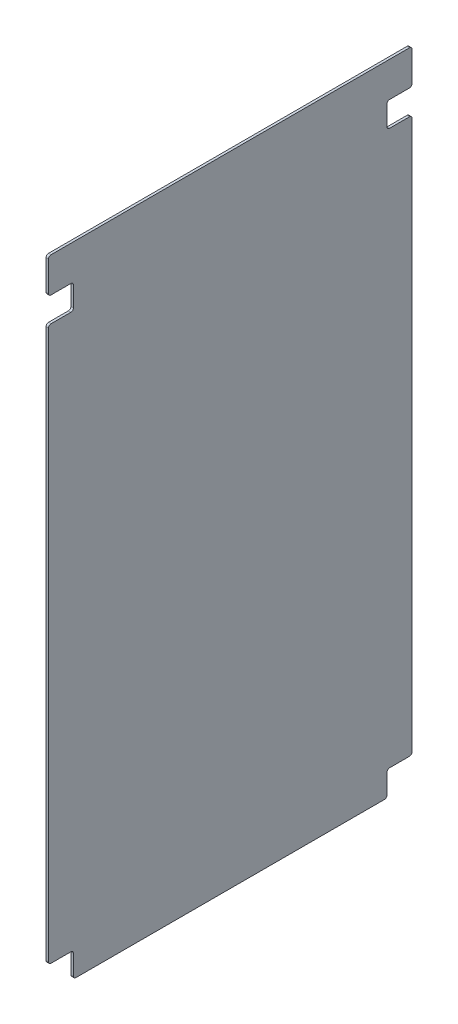
ISO-10303-21;
HEADER;
FILE_DESCRIPTION(('STEP AP214'),'2;1');
FILE_NAME('part.step','',(''),(''),'','','');
FILE_SCHEMA(('AUTOMOTIVE_DESIGN { 1 0 10303 214 1 1 1 1 }'));
ENDSEC;
DATA;
#1=APPLICATION_CONTEXT('core data for automotive mechanical design processes');
#2=APPLICATION_PROTOCOL_DEFINITION('international standard','automotive_design',2000,#1);
#3=PRODUCT_CONTEXT('',#1,'mechanical');
#4=PRODUCT('Part','Part','',(#3));
#5=PRODUCT_RELATED_PRODUCT_CATEGORY('part','',(#4));
#6=PRODUCT_DEFINITION_FORMATION('','',#4);
#7=PRODUCT_DEFINITION_CONTEXT('part definition',#1,'design');
#8=PRODUCT_DEFINITION('design','',#6,#7);
#9=PRODUCT_DEFINITION_SHAPE('','',#8);
#10=(LENGTH_UNIT() NAMED_UNIT(*) SI_UNIT(.MILLI.,.METRE.));
#11=(NAMED_UNIT(*) PLANE_ANGLE_UNIT() SI_UNIT($,.RADIAN.));
#12=(NAMED_UNIT(*) SI_UNIT($,.STERADIAN.) SOLID_ANGLE_UNIT());
#13=UNCERTAINTY_MEASURE_WITH_UNIT(LENGTH_MEASURE(1.E-05),#10,'distance_accuracy_value','');
#14=(GEOMETRIC_REPRESENTATION_CONTEXT(3) GLOBAL_UNCERTAINTY_ASSIGNED_CONTEXT((#13)) GLOBAL_UNIT_ASSIGNED_CONTEXT((#10,
#11,#12)) REPRESENTATION_CONTEXT('',''));
#15=CARTESIAN_POINT('',(0.,0.,0.));
#16=DIRECTION('',(0.,0.,1.));
#17=DIRECTION('',(1.,0.,0.));
#18=AXIS2_PLACEMENT_3D('',#15,#16,#17);
#19=CARTESIAN_POINT('',(3.175,0.,-463.55));
#20=DIRECTION('',(0.,0.,1.));
#21=DIRECTION('',(1.,0.,0.));
#22=AXIS2_PLACEMENT_3D('',#19,#20,#21);
#23=PLANE('',#22);
#24=DIRECTION('',(0.,1.,0.));
#25=VECTOR('',#24,1.);
#26=CARTESIAN_POINT('',(3.175,0.,-463.55));
#27=LINE('',#26,#25);
#28=CARTESIAN_POINT('',(3.175,773.1125,-463.55));
#29=VERTEX_POINT('',#28);
#30=CARTESIAN_POINT('',(3.175,811.2125,-463.55));
#31=VERTEX_POINT('',#30);
#32=EDGE_CURVE('E477',#29,#31,#27,.T.);
#33=ORIENTED_EDGE('',*,*,#32,.F.);
#34=DIRECTION('',(1.,0.,0.));
#35=VECTOR('',#34,1.);
#36=CARTESIAN_POINT('',(3.175,773.1125,-463.55));
#37=LINE('',#36,#35);
#38=CARTESIAN_POINT('',(0.,773.1125,-463.55));
#39=VERTEX_POINT('',#38);
#40=EDGE_CURVE('E250',#29,#39,#37,.F.);
#41=ORIENTED_EDGE('',*,*,#40,.T.);
#42=DIRECTION('',(0.,1.,0.));
#43=VECTOR('',#42,1.);
#44=CARTESIAN_POINT('',(0.,0.,-463.55));
#45=LINE('',#44,#43);
#46=CARTESIAN_POINT('',(0.,811.2125,-463.55));
#47=VERTEX_POINT('',#46);
#48=EDGE_CURVE('E243',#39,#47,#45,.T.);
#49=ORIENTED_EDGE('',*,*,#48,.T.);
#50=DIRECTION('',(-1.,0.,0.));
#51=VECTOR('',#50,1.);
#52=CARTESIAN_POINT('',(3.175,811.2125,-463.55));
#53=LINE('',#52,#51);
#54=EDGE_CURVE('E247',#47,#31,#53,.F.);
#55=ORIENTED_EDGE('',*,*,#54,.T.);
#56=EDGE_LOOP('',(#33,#41,#49,#55));
#57=FACE_BOUND('',#56,.T.);
#58=ADVANCED_FACE('F32',(#57),#23,.F.);
#59=CARTESIAN_POINT('',(3.175,0.,0.));
#60=DIRECTION('',(0.,0.,-1.));
#61=DIRECTION('',(-1.,0.,0.));
#62=AXIS2_PLACEMENT_3D('',#59,#60,#61);
#63=PLANE('',#62);
#64=DIRECTION('',(0.,-1.,0.));
#65=VECTOR('',#64,1.);
#66=CARTESIAN_POINT('',(0.,0.,0.));
#67=LINE('',#66,#65);
#68=CARTESIAN_POINT('',(0.,811.2125,0.));
#69=VERTEX_POINT('',#68);
#70=CARTESIAN_POINT('',(0.,773.1125,0.));
#71=VERTEX_POINT('',#70);
#72=EDGE_CURVE('E479',#69,#71,#67,.T.);
#73=ORIENTED_EDGE('',*,*,#72,.T.);
#74=DIRECTION('',(1.,0.,0.));
#75=VECTOR('',#74,1.);
#76=CARTESIAN_POINT('',(3.175,773.1125,0.));
#77=LINE('',#76,#75);
#78=CARTESIAN_POINT('',(3.175,773.1125,0.));
#79=VERTEX_POINT('',#78);
#80=EDGE_CURVE('E311',#71,#79,#77,.T.);
#81=ORIENTED_EDGE('',*,*,#80,.T.);
#82=DIRECTION('',(0.,-1.,0.));
#83=VECTOR('',#82,1.);
#84=CARTESIAN_POINT('',(3.175,0.,0.));
#85=LINE('',#84,#83);
#86=CARTESIAN_POINT('',(3.175,811.2125,0.));
#87=VERTEX_POINT('',#86);
#88=EDGE_CURVE('E470',#87,#79,#85,.T.);
#89=ORIENTED_EDGE('',*,*,#88,.F.);
#90=DIRECTION('',(-1.,0.,0.));
#91=VECTOR('',#90,1.);
#92=CARTESIAN_POINT('',(3.175,811.2125,0.));
#93=LINE('',#92,#91);
#94=EDGE_CURVE('E279',#87,#69,#93,.T.);
#95=ORIENTED_EDGE('',*,*,#94,.T.);
#96=EDGE_LOOP('',(#73,#81,#89,#95));
#97=FACE_BOUND('',#96,.T.);
#98=ADVANCED_FACE('F525',(#97),#63,.F.);
#99=CARTESIAN_POINT('',(0.,735.0125,0.));
#100=VERTEX_POINT('',#99);
#101=CARTESIAN_POINT('',(0.,34.925,0.));
#102=VERTEX_POINT('',#101);
#103=EDGE_CURVE('E469',#100,#102,#67,.T.);
#104=ORIENTED_EDGE('',*,*,#103,.T.);
#105=DIRECTION('',(1.,0.,0.));
#106=VECTOR('',#105,1.);
#107=CARTESIAN_POINT('',(3.175,34.925,0.));
#108=LINE('',#107,#106);
#109=CARTESIAN_POINT('',(3.175,34.925,0.));
#110=VERTEX_POINT('',#109);
#111=EDGE_CURVE('E390',#102,#110,#108,.T.);
#112=ORIENTED_EDGE('',*,*,#111,.T.);
#113=CARTESIAN_POINT('',(3.175,735.0125,0.));
#114=VERTEX_POINT('',#113);
#115=EDGE_CURVE('E474',#114,#110,#85,.T.);
#116=ORIENTED_EDGE('',*,*,#115,.F.);
#117=DIRECTION('',(1.,0.,0.));
#118=VECTOR('',#117,1.);
#119=CARTESIAN_POINT('',(3.175,735.0125,0.));
#120=LINE('',#119,#118);
#121=EDGE_CURVE('E300',#114,#100,#120,.F.);
#122=ORIENTED_EDGE('',*,*,#121,.T.);
#123=EDGE_LOOP('',(#104,#112,#116,#122));
#124=FACE_BOUND('',#123,.T.);
#125=ADVANCED_FACE('F491',(#124),#63,.F.);
#126=CARTESIAN_POINT('',(3.175,0.,0.));
#127=DIRECTION('',(0.,1.,0.));
#128=DIRECTION('',(0.,0.,1.));
#129=AXIS2_PLACEMENT_3D('',#126,#127,#128);
#130=PLANE('',#129);
#131=DIRECTION('',(0.,0.,-1.));
#132=VECTOR('',#131,1.);
#133=CARTESIAN_POINT('',(0.,0.,0.));
#134=LINE('',#133,#132);
#135=CARTESIAN_POINT('',(0.,0.,-34.925));
#136=VERTEX_POINT('',#135);
#137=CARTESIAN_POINT('',(0.,0.,-428.625));
#138=VERTEX_POINT('',#137);
#139=EDGE_CURVE('E253',#136,#138,#134,.T.);
#140=ORIENTED_EDGE('',*,*,#139,.T.);
#141=DIRECTION('',(1.,0.,0.));
#142=VECTOR('',#141,1.);
#143=CARTESIAN_POINT('',(3.175,0.,-428.625));
#144=LINE('',#143,#142);
#145=CARTESIAN_POINT('',(3.175,0.,-428.625));
#146=VERTEX_POINT('',#145);
#147=EDGE_CURVE('E387',#138,#146,#144,.T.);
#148=ORIENTED_EDGE('',*,*,#147,.T.);
#149=DIRECTION('',(0.,0.,-1.));
#150=VECTOR('',#149,1.);
#151=CARTESIAN_POINT('',(3.175,0.,0.));
#152=LINE('',#151,#150);
#153=CARTESIAN_POINT('',(3.175,0.,-34.925));
#154=VERTEX_POINT('',#153);
#155=EDGE_CURVE('E473',#154,#146,#152,.T.);
#156=ORIENTED_EDGE('',*,*,#155,.F.);
#157=DIRECTION('',(1.,0.,0.));
#158=VECTOR('',#157,1.);
#159=CARTESIAN_POINT('',(3.175,0.,-34.925));
#160=LINE('',#159,#158);
#161=EDGE_CURVE('E385',#154,#136,#160,.F.);
#162=ORIENTED_EDGE('',*,*,#161,.T.);
#163=EDGE_LOOP('',(#140,#148,#156,#162));
#164=FACE_BOUND('',#163,.T.);
#165=ADVANCED_FACE('F599',(#164),#130,.F.);
#166=CARTESIAN_POINT('',(3.175,34.9250000000001,-463.55));
#167=VERTEX_POINT('',#166);
#168=CARTESIAN_POINT('',(3.175,735.0125,-463.55));
#169=VERTEX_POINT('',#168);
#170=EDGE_CURVE('E273',#167,#169,#27,.T.);
#171=ORIENTED_EDGE('',*,*,#170,.F.);
#172=DIRECTION('',(1.,0.,0.));
#173=VECTOR('',#172,1.);
#174=CARTESIAN_POINT('',(3.175,34.9250000000001,-463.55));
#175=LINE('',#174,#173);
#176=CARTESIAN_POINT('',(0.,34.9250000000001,-463.55));
#177=VERTEX_POINT('',#176);
#178=EDGE_CURVE('E371',#167,#177,#175,.F.);
#179=ORIENTED_EDGE('',*,*,#178,.T.);
#180=CARTESIAN_POINT('',(0.,735.0125,-463.55));
#181=VERTEX_POINT('',#180);
#182=EDGE_CURVE('E252',#177,#181,#45,.T.);
#183=ORIENTED_EDGE('',*,*,#182,.T.);
#184=DIRECTION('',(1.,0.,0.));
#185=VECTOR('',#184,1.);
#186=CARTESIAN_POINT('',(3.175,735.0125,-463.55));
#187=LINE('',#186,#185);
#188=EDGE_CURVE('E337',#181,#169,#187,.T.);
#189=ORIENTED_EDGE('',*,*,#188,.T.);
#190=EDGE_LOOP('',(#171,#179,#183,#189));
#191=FACE_BOUND('',#190,.T.);
#192=ADVANCED_FACE('F611',(#191),#23,.F.);
#193=CARTESIAN_POINT('',(3.175,814.3875,0.));
#194=DIRECTION('',(0.,-1.,0.));
#195=DIRECTION('',(0.,0.,-1.));
#196=AXIS2_PLACEMENT_3D('',#193,#194,#195);
#197=PLANE('',#196);
#198=DIRECTION('',(0.,0.,1.));
#199=VECTOR('',#198,1.);
#200=CARTESIAN_POINT('',(3.175,814.3875,0.));
#201=LINE('',#200,#199);
#202=CARTESIAN_POINT('',(3.175,814.3875,-460.375));
#203=VERTEX_POINT('',#202);
#204=CARTESIAN_POINT('',(3.175,814.3875,-3.175));
#205=VERTEX_POINT('',#204);
#206=EDGE_CURVE('E269',#203,#205,#201,.T.);
#207=ORIENTED_EDGE('',*,*,#206,.F.);
#208=DIRECTION('',(-1.,0.,0.));
#209=VECTOR('',#208,1.);
#210=CARTESIAN_POINT('',(3.175,814.3875,-460.375));
#211=LINE('',#210,#209);
#212=CARTESIAN_POINT('',(0.,814.3875,-460.375));
#213=VERTEX_POINT('',#212);
#214=EDGE_CURVE('E284',#203,#213,#211,.T.);
#215=ORIENTED_EDGE('',*,*,#214,.T.);
#216=DIRECTION('',(0.,0.,1.));
#217=VECTOR('',#216,1.);
#218=CARTESIAN_POINT('',(0.,814.3875,0.));
#219=LINE('',#218,#217);
#220=CARTESIAN_POINT('',(0.,814.3875,-3.175));
#221=VERTEX_POINT('',#220);
#222=EDGE_CURVE('E260',#213,#221,#219,.T.);
#223=ORIENTED_EDGE('',*,*,#222,.T.);
#224=DIRECTION('',(-1.,0.,0.));
#225=VECTOR('',#224,1.);
#226=CARTESIAN_POINT('',(3.175,814.3875,-3.175));
#227=LINE('',#226,#225);
#228=EDGE_CURVE('E282',#221,#205,#227,.F.);
#229=ORIENTED_EDGE('',*,*,#228,.T.);
#230=EDGE_LOOP('',(#207,#215,#223,#229));
#231=FACE_BOUND('',#230,.T.);
#232=ADVANCED_FACE('F532',(#231),#197,.F.);
#233=CARTESIAN_POINT('',(3.175,0.,0.));
#234=DIRECTION('',(-1.,0.,0.));
#235=DIRECTION('',(0.,0.,1.));
#236=AXIS2_PLACEMENT_3D('',#233,#234,#235);
#237=PLANE('',#236);
#238=DIRECTION('',(0.,0.,1.));
#239=VECTOR('',#238,1.);
#240=CARTESIAN_POINT('',(3.175,31.7500000000001,-463.55));
#241=LINE('',#240,#239);
#242=CARTESIAN_POINT('',(3.175,31.7500000000001,-460.375));
#243=VERTEX_POINT('',#242);
#244=CARTESIAN_POINT('',(3.175,31.75,-434.975));
#245=VERTEX_POINT('',#244);
#246=EDGE_CURVE('E574',#243,#245,#241,.T.);
#247=ORIENTED_EDGE('',*,*,#246,.F.);
#248=CARTESIAN_POINT('',(3.175,34.9250000000001,-460.375));
#249=DIRECTION('',(-1.,0.,0.));
#250=DIRECTION('',(0.,0.,1.));
#251=AXIS2_PLACEMENT_3D('',#248,#249,#250);
#252=CIRCLE('',#251,3.175);
#253=EDGE_CURVE('E369',#243,#167,#252,.F.);
#254=ORIENTED_EDGE('',*,*,#253,.T.);
#255=ORIENTED_EDGE('',*,*,#170,.T.);
#256=CARTESIAN_POINT('',(3.175,735.0125,-460.375));
#257=DIRECTION('',(-1.,0.,0.));
#258=DIRECTION('',(0.,0.,1.));
#259=AXIS2_PLACEMENT_3D('',#256,#257,#258);
#260=CIRCLE('',#259,3.175);
#261=CARTESIAN_POINT('',(3.175,738.1875,-460.375));
#262=VERTEX_POINT('',#261);
#263=EDGE_CURVE('E342',#169,#262,#260,.F.);
#264=ORIENTED_EDGE('',*,*,#263,.T.);
#265=DIRECTION('',(0.,0.,-1.));
#266=VECTOR('',#265,1.);
#267=CARTESIAN_POINT('',(3.175,738.1875,-463.55));
#268=LINE('',#267,#266);
#269=CARTESIAN_POINT('',(3.175,738.1875,-434.975));
#270=VERTEX_POINT('',#269);
#271=EDGE_CURVE('E445',#270,#262,#268,.T.);
#272=ORIENTED_EDGE('',*,*,#271,.F.);
#273=CARTESIAN_POINT('',(3.175,741.3625,-434.975));
#274=DIRECTION('',(-1.,0.,0.));
#275=DIRECTION('',(0.,0.,1.));
#276=AXIS2_PLACEMENT_3D('',#273,#274,#275);
#277=CIRCLE('',#276,3.175);
#278=CARTESIAN_POINT('',(3.175,741.3625,-431.8));
#279=VERTEX_POINT('',#278);
#280=EDGE_CURVE('E354',#270,#279,#277,.T.);
#281=ORIENTED_EDGE('',*,*,#280,.T.);
#282=DIRECTION('',(0.,-1.,0.));
#283=VECTOR('',#282,1.);
#284=CARTESIAN_POINT('',(3.175,769.9375,-431.8));
#285=LINE('',#284,#283);
#286=CARTESIAN_POINT('',(3.175,766.7625,-431.8));
#287=VERTEX_POINT('',#286);
#288=EDGE_CURVE('E442',#287,#279,#285,.T.);
#289=ORIENTED_EDGE('',*,*,#288,.F.);
#290=CARTESIAN_POINT('',(3.175,766.7625,-434.975));
#291=DIRECTION('',(-1.,0.,0.));
#292=DIRECTION('',(0.,0.,1.));
#293=AXIS2_PLACEMENT_3D('',#290,#291,#292);
#294=CIRCLE('',#293,3.175);
#295=CARTESIAN_POINT('',(3.175,769.9375,-434.975));
#296=VERTEX_POINT('',#295);
#297=EDGE_CURVE('E350',#287,#296,#294,.T.);
#298=ORIENTED_EDGE('',*,*,#297,.T.);
#299=DIRECTION('',(0.,0.,1.));
#300=VECTOR('',#299,1.);
#301=CARTESIAN_POINT('',(3.175,769.9375,-463.55));
#302=LINE('',#301,#300);
#303=CARTESIAN_POINT('',(3.175,769.9375,-460.375));
#304=VERTEX_POINT('',#303);
#305=EDGE_CURVE('E439',#304,#296,#302,.T.);
#306=ORIENTED_EDGE('',*,*,#305,.F.);
#307=CARTESIAN_POINT('',(3.175,773.1125,-460.375));
#308=DIRECTION('',(-1.,0.,0.));
#309=DIRECTION('',(0.,0.,1.));
#310=AXIS2_PLACEMENT_3D('',#307,#308,#309);
#311=CIRCLE('',#310,3.175);
#312=EDGE_CURVE('E340',#304,#29,#311,.F.);
#313=ORIENTED_EDGE('',*,*,#312,.T.);
#314=ORIENTED_EDGE('',*,*,#32,.T.);
#315=CARTESIAN_POINT('',(3.175,811.2125,-460.375));
#316=DIRECTION('',(-1.,0.,0.));
#317=DIRECTION('',(0.,0.,1.));
#318=AXIS2_PLACEMENT_3D('',#315,#316,#317);
#319=CIRCLE('',#318,3.175);
#320=EDGE_CURVE('E268',#31,#203,#319,.F.);
#321=ORIENTED_EDGE('',*,*,#320,.T.);
#322=ORIENTED_EDGE('',*,*,#206,.T.);
#323=CARTESIAN_POINT('',(3.175,811.2125,-3.175));
#324=DIRECTION('',(-1.,0.,0.));
#325=DIRECTION('',(0.,0.,1.));
#326=AXIS2_PLACEMENT_3D('',#323,#324,#325);
#327=CIRCLE('',#326,3.175);
#328=EDGE_CURVE('E264',#205,#87,#327,.F.);
#329=ORIENTED_EDGE('',*,*,#328,.T.);
#330=ORIENTED_EDGE('',*,*,#88,.T.);
#331=CARTESIAN_POINT('',(3.175,773.1125,-3.175));
#332=DIRECTION('',(-1.,0.,0.));
#333=DIRECTION('',(0.,0.,1.));
#334=AXIS2_PLACEMENT_3D('',#331,#332,#333);
#335=CIRCLE('',#334,3.175);
#336=CARTESIAN_POINT('',(3.175,769.9375,-3.175));
#337=VERTEX_POINT('',#336);
#338=EDGE_CURVE('E296',#79,#337,#335,.F.);
#339=ORIENTED_EDGE('',*,*,#338,.T.);
#340=DIRECTION('',(0.,0.,1.));
#341=VECTOR('',#340,1.);
#342=CARTESIAN_POINT('',(3.175,769.9375,0.));
#343=LINE('',#342,#341);
#344=CARTESIAN_POINT('',(3.175,769.9375,-28.575));
#345=VERTEX_POINT('',#344);
#346=EDGE_CURVE('E463',#345,#337,#343,.T.);
#347=ORIENTED_EDGE('',*,*,#346,.F.);
#348=CARTESIAN_POINT('',(3.175,766.7625,-28.575));
#349=DIRECTION('',(-1.,0.,0.));
#350=DIRECTION('',(0.,0.,1.));
#351=AXIS2_PLACEMENT_3D('',#348,#349,#350);
#352=CIRCLE('',#351,3.175);
#353=CARTESIAN_POINT('',(3.175,766.7625,-31.75));
#354=VERTEX_POINT('',#353);
#355=EDGE_CURVE('E318',#345,#354,#352,.T.);
#356=ORIENTED_EDGE('',*,*,#355,.T.);
#357=DIRECTION('',(0.,1.,0.));
#358=VECTOR('',#357,1.);
#359=CARTESIAN_POINT('',(3.175,769.9375,-31.75));
#360=LINE('',#359,#358);
#361=CARTESIAN_POINT('',(3.175,741.3625,-31.75));
#362=VERTEX_POINT('',#361);
#363=EDGE_CURVE('E460',#362,#354,#360,.T.);
#364=ORIENTED_EDGE('',*,*,#363,.F.);
#365=CARTESIAN_POINT('',(3.175,741.3625,-28.575));
#366=DIRECTION('',(-1.,0.,0.));
#367=DIRECTION('',(0.,0.,1.));
#368=AXIS2_PLACEMENT_3D('',#365,#366,#367);
#369=CIRCLE('',#368,3.175);
#370=CARTESIAN_POINT('',(3.175,738.1875,-28.575));
#371=VERTEX_POINT('',#370);
#372=EDGE_CURVE('E314',#362,#371,#369,.T.);
#373=ORIENTED_EDGE('',*,*,#372,.T.);
#374=DIRECTION('',(0.,0.,-1.));
#375=VECTOR('',#374,1.);
#376=CARTESIAN_POINT('',(3.175,738.1875,0.));
#377=LINE('',#376,#375);
#378=CARTESIAN_POINT('',(3.175,738.1875,-3.175));
#379=VERTEX_POINT('',#378);
#380=EDGE_CURVE('E457',#379,#371,#377,.T.);
#381=ORIENTED_EDGE('',*,*,#380,.F.);
#382=CARTESIAN_POINT('',(3.175,735.0125,-3.175));
#383=DIRECTION('',(-1.,0.,0.));
#384=DIRECTION('',(0.,0.,1.));
#385=AXIS2_PLACEMENT_3D('',#382,#383,#384);
#386=CIRCLE('',#385,3.175);
#387=EDGE_CURVE('E298',#379,#114,#386,.F.);
#388=ORIENTED_EDGE('',*,*,#387,.T.);
#389=ORIENTED_EDGE('',*,*,#115,.T.);
#390=CARTESIAN_POINT('',(3.175,34.925,-3.175));
#391=DIRECTION('',(-1.,0.,0.));
#392=DIRECTION('',(0.,0.,1.));
#393=AXIS2_PLACEMENT_3D('',#390,#391,#392);
#394=CIRCLE('',#393,3.175);
#395=CARTESIAN_POINT('',(3.175,31.75,-3.175));
#396=VERTEX_POINT('',#395);
#397=EDGE_CURVE('E365',#110,#396,#394,.F.);
#398=ORIENTED_EDGE('',*,*,#397,.T.);
#399=DIRECTION('',(0.,0.,1.));
#400=VECTOR('',#399,1.);
#401=CARTESIAN_POINT('',(3.175,31.75,0.));
#402=LINE('',#401,#400);
#403=CARTESIAN_POINT('',(3.175,31.75,-28.575));
#404=VERTEX_POINT('',#403);
#405=EDGE_CURVE('E412',#404,#396,#402,.T.);
#406=ORIENTED_EDGE('',*,*,#405,.F.);
#407=CARTESIAN_POINT('',(3.175,28.575,-28.575));
#408=DIRECTION('',(-1.,0.,0.));
#409=DIRECTION('',(0.,0.,1.));
#410=AXIS2_PLACEMENT_3D('',#407,#408,#409);
#411=CIRCLE('',#410,3.175);
#412=CARTESIAN_POINT('',(3.175,28.575,-31.75));
#413=VERTEX_POINT('',#412);
#414=EDGE_CURVE('E40',#404,#413,#411,.T.);
#415=ORIENTED_EDGE('',*,*,#414,.T.);
#416=DIRECTION('',(0.,1.,0.));
#417=VECTOR('',#416,1.);
#418=CARTESIAN_POINT('',(3.175,0.,-31.75));
#419=LINE('',#418,#417);
#420=CARTESIAN_POINT('',(3.175,3.175,-31.75));
#421=VERTEX_POINT('',#420);
#422=EDGE_CURVE('E411',#421,#413,#419,.T.);
#423=ORIENTED_EDGE('',*,*,#422,.F.);
#424=CARTESIAN_POINT('',(3.175,3.175,-34.925));
#425=DIRECTION('',(-1.,0.,0.));
#426=DIRECTION('',(0.,0.,1.));
#427=AXIS2_PLACEMENT_3D('',#424,#425,#426);
#428=CIRCLE('',#427,3.175);
#429=EDGE_CURVE('E363',#421,#154,#428,.F.);
#430=ORIENTED_EDGE('',*,*,#429,.T.);
#431=ORIENTED_EDGE('',*,*,#155,.T.);
#432=CARTESIAN_POINT('',(3.175,3.175,-428.625));
#433=DIRECTION('',(-1.,0.,0.));
#434=DIRECTION('',(0.,0.,1.));
#435=AXIS2_PLACEMENT_3D('',#432,#433,#434);
#436=CIRCLE('',#435,3.175);
#437=CARTESIAN_POINT('',(3.175,3.17499999999998,-431.8));
#438=VERTEX_POINT('',#437);
#439=EDGE_CURVE('E367',#146,#438,#436,.F.);
#440=ORIENTED_EDGE('',*,*,#439,.T.);
#441=DIRECTION('',(0.,-1.,0.));
#442=VECTOR('',#441,1.);
#443=CARTESIAN_POINT('',(3.175,0.,-431.8));
#444=LINE('',#443,#442);
#445=CARTESIAN_POINT('',(3.175,28.5750000000001,-431.8));
#446=VERTEX_POINT('',#445);
#447=EDGE_CURVE('E428',#446,#438,#444,.T.);
#448=ORIENTED_EDGE('',*,*,#447,.F.);
#449=CARTESIAN_POINT('',(3.175,28.575,-434.975));
#450=DIRECTION('',(-1.,0.,0.));
#451=DIRECTION('',(0.,0.,1.));
#452=AXIS2_PLACEMENT_3D('',#449,#450,#451);
#453=CIRCLE('',#452,3.175);
#454=EDGE_CURVE('E402',#446,#245,#453,.T.);
#455=ORIENTED_EDGE('',*,*,#454,.T.);
#456=EDGE_LOOP('',(#247,#254,#255,#264,#272,#281,#289,#298,#306,#313,#314,#321,#322,#329,#330,
#339,#347,#356,#364,#373,#381,#388,#389,#398,#406,#415,#423,#430,#431,#440,#448,#455));
#457=FACE_BOUND('',#456,.T.);
#458=ADVANCED_FACE('F410',(#457),#237,.F.);
#459=CARTESIAN_POINT('',(0.,0.,0.));
#460=DIRECTION('',(-1.,0.,0.));
#461=DIRECTION('',(0.,0.,1.));
#462=AXIS2_PLACEMENT_3D('',#459,#460,#461);
#463=PLANE('',#462);
#464=ORIENTED_EDGE('',*,*,#182,.F.);
#465=CARTESIAN_POINT('',(0.,34.9250000000001,-460.375));
#466=DIRECTION('',(-1.,0.,0.));
#467=DIRECTION('',(0.,0.,1.));
#468=AXIS2_PLACEMENT_3D('',#465,#466,#467);
#469=CIRCLE('',#468,3.175);
#470=CARTESIAN_POINT('',(0.,31.7500000000001,-460.375));
#471=VERTEX_POINT('',#470);
#472=EDGE_CURVE('E378',#177,#471,#469,.T.);
#473=ORIENTED_EDGE('',*,*,#472,.T.);
#474=DIRECTION('',(0.,0.,1.));
#475=VECTOR('',#474,1.);
#476=CARTESIAN_POINT('',(0.,31.7500000000001,-463.55));
#477=LINE('',#476,#475);
#478=CARTESIAN_POINT('',(0.,31.75,-434.975));
#479=VERTEX_POINT('',#478);
#480=EDGE_CURVE('E576',#471,#479,#477,.T.);
#481=ORIENTED_EDGE('',*,*,#480,.T.);
#482=CARTESIAN_POINT('',(0.,28.575,-434.975));
#483=DIRECTION('',(-1.,0.,0.));
#484=DIRECTION('',(0.,0.,1.));
#485=AXIS2_PLACEMENT_3D('',#482,#483,#484);
#486=CIRCLE('',#485,3.175);
#487=CARTESIAN_POINT('',(0.,28.5750000000001,-431.8));
#488=VERTEX_POINT('',#487);
#489=EDGE_CURVE('E404',#479,#488,#486,.F.);
#490=ORIENTED_EDGE('',*,*,#489,.T.);
#491=DIRECTION('',(0.,-1.,0.));
#492=VECTOR('',#491,1.);
#493=CARTESIAN_POINT('',(0.,0.,-431.8));
#494=LINE('',#493,#492);
#495=CARTESIAN_POINT('',(0.,3.17499999999998,-431.8));
#496=VERTEX_POINT('',#495);
#497=EDGE_CURVE('E579',#488,#496,#494,.T.);
#498=ORIENTED_EDGE('',*,*,#497,.T.);
#499=CARTESIAN_POINT('',(0.,3.175,-428.625));
#500=DIRECTION('',(-1.,0.,0.));
#501=DIRECTION('',(0.,0.,1.));
#502=AXIS2_PLACEMENT_3D('',#499,#500,#501);
#503=CIRCLE('',#502,3.175);
#504=EDGE_CURVE('E376',#496,#138,#503,.T.);
#505=ORIENTED_EDGE('',*,*,#504,.T.);
#506=ORIENTED_EDGE('',*,*,#139,.F.);
#507=CARTESIAN_POINT('',(0.,3.175,-34.925));
#508=DIRECTION('',(-1.,0.,0.));
#509=DIRECTION('',(0.,0.,1.));
#510=AXIS2_PLACEMENT_3D('',#507,#508,#509);
#511=CIRCLE('',#510,3.175);
#512=CARTESIAN_POINT('',(0.,3.175,-31.75));
#513=VERTEX_POINT('',#512);
#514=EDGE_CURVE('E373',#136,#513,#511,.T.);
#515=ORIENTED_EDGE('',*,*,#514,.T.);
#516=DIRECTION('',(0.,1.,0.));
#517=VECTOR('',#516,1.);
#518=CARTESIAN_POINT('',(0.,0.,-31.75));
#519=LINE('',#518,#517);
#520=CARTESIAN_POINT('',(0.,28.575,-31.75));
#521=VERTEX_POINT('',#520);
#522=EDGE_CURVE('E425',#513,#521,#519,.T.);
#523=ORIENTED_EDGE('',*,*,#522,.T.);
#524=CARTESIAN_POINT('',(0.,28.575,-28.575));
#525=DIRECTION('',(-1.,0.,0.));
#526=DIRECTION('',(0.,0.,1.));
#527=AXIS2_PLACEMENT_3D('',#524,#525,#526);
#528=CIRCLE('',#527,3.175);
#529=CARTESIAN_POINT('',(0.,31.75,-28.575));
#530=VERTEX_POINT('',#529);
#531=EDGE_CURVE('E11',#521,#530,#528,.F.);
#532=ORIENTED_EDGE('',*,*,#531,.T.);
#533=DIRECTION('',(0.,0.,1.));
#534=VECTOR('',#533,1.);
#535=CARTESIAN_POINT('',(0.,31.75,0.));
#536=LINE('',#535,#534);
#537=CARTESIAN_POINT('',(0.,31.75,-3.175));
#538=VERTEX_POINT('',#537);
#539=EDGE_CURVE('E421',#530,#538,#536,.T.);
#540=ORIENTED_EDGE('',*,*,#539,.T.);
#541=CARTESIAN_POINT('',(0.,34.925,-3.175));
#542=DIRECTION('',(-1.,0.,0.));
#543=DIRECTION('',(0.,0.,1.));
#544=AXIS2_PLACEMENT_3D('',#541,#542,#543);
#545=CIRCLE('',#544,3.175);
#546=EDGE_CURVE('E47',#538,#102,#545,.T.);
#547=ORIENTED_EDGE('',*,*,#546,.T.);
#548=ORIENTED_EDGE('',*,*,#103,.F.);
#549=CARTESIAN_POINT('',(0.,735.0125,-3.175));
#550=DIRECTION('',(-1.,0.,0.));
#551=DIRECTION('',(0.,0.,1.));
#552=AXIS2_PLACEMENT_3D('',#549,#550,#551);
#553=CIRCLE('',#552,3.175);
#554=CARTESIAN_POINT('',(0.,738.1875,-3.175));
#555=VERTEX_POINT('',#554);
#556=EDGE_CURVE('E304',#100,#555,#553,.T.);
#557=ORIENTED_EDGE('',*,*,#556,.T.);
#558=DIRECTION('',(0.,0.,-1.));
#559=VECTOR('',#558,1.);
#560=CARTESIAN_POINT('',(0.,738.1875,0.));
#561=LINE('',#560,#559);
#562=CARTESIAN_POINT('',(0.,738.1875,-28.575));
#563=VERTEX_POINT('',#562);
#564=EDGE_CURVE('E466',#555,#563,#561,.T.);
#565=ORIENTED_EDGE('',*,*,#564,.T.);
#566=CARTESIAN_POINT('',(0.,741.3625,-28.575));
#567=DIRECTION('',(-1.,0.,0.));
#568=DIRECTION('',(0.,0.,1.));
#569=AXIS2_PLACEMENT_3D('',#566,#567,#568);
#570=CIRCLE('',#569,3.175);
#571=CARTESIAN_POINT('',(0.,741.3625,-31.75));
#572=VERTEX_POINT('',#571);
#573=EDGE_CURVE('E316',#563,#572,#570,.F.);
#574=ORIENTED_EDGE('',*,*,#573,.T.);
#575=DIRECTION('',(0.,1.,0.));
#576=VECTOR('',#575,1.);
#577=CARTESIAN_POINT('',(0.,769.9375,-31.75));
#578=LINE('',#577,#576);
#579=CARTESIAN_POINT('',(0.,766.7625,-31.75));
#580=VERTEX_POINT('',#579);
#581=EDGE_CURVE('E451',#572,#580,#578,.T.);
#582=ORIENTED_EDGE('',*,*,#581,.T.);
#583=CARTESIAN_POINT('',(0.,766.7625,-28.575));
#584=DIRECTION('',(-1.,0.,0.));
#585=DIRECTION('',(0.,0.,1.));
#586=AXIS2_PLACEMENT_3D('',#583,#584,#585);
#587=CIRCLE('',#586,3.175);
#588=CARTESIAN_POINT('',(0.,769.9375,-28.575));
#589=VERTEX_POINT('',#588);
#590=EDGE_CURVE('E320',#580,#589,#587,.F.);
#591=ORIENTED_EDGE('',*,*,#590,.T.);
#592=DIRECTION('',(0.,0.,1.));
#593=VECTOR('',#592,1.);
#594=CARTESIAN_POINT('',(0.,769.9375,0.));
#595=LINE('',#594,#593);
#596=CARTESIAN_POINT('',(0.,769.9375,-3.175));
#597=VERTEX_POINT('',#596);
#598=EDGE_CURVE('E454',#589,#597,#595,.T.);
#599=ORIENTED_EDGE('',*,*,#598,.T.);
#600=CARTESIAN_POINT('',(0.,773.1125,-3.175));
#601=DIRECTION('',(-1.,0.,0.));
#602=DIRECTION('',(0.,0.,1.));
#603=AXIS2_PLACEMENT_3D('',#600,#601,#602);
#604=CIRCLE('',#603,3.175);
#605=EDGE_CURVE('E302',#597,#71,#604,.T.);
#606=ORIENTED_EDGE('',*,*,#605,.T.);
#607=ORIENTED_EDGE('',*,*,#72,.F.);
#608=CARTESIAN_POINT('',(0.,811.2125,-3.175));
#609=DIRECTION('',(-1.,0.,0.));
#610=DIRECTION('',(0.,0.,1.));
#611=AXIS2_PLACEMENT_3D('',#608,#609,#610);
#612=CIRCLE('',#611,3.175);
#613=EDGE_CURVE('E265',#69,#221,#612,.T.);
#614=ORIENTED_EDGE('',*,*,#613,.T.);
#615=ORIENTED_EDGE('',*,*,#222,.F.);
#616=CARTESIAN_POINT('',(0.,811.2125,-460.375));
#617=DIRECTION('',(-1.,0.,0.));
#618=DIRECTION('',(0.,0.,1.));
#619=AXIS2_PLACEMENT_3D('',#616,#617,#618);
#620=CIRCLE('',#619,3.175);
#621=EDGE_CURVE('E256',#213,#47,#620,.T.);
#622=ORIENTED_EDGE('',*,*,#621,.T.);
#623=ORIENTED_EDGE('',*,*,#48,.F.);
#624=CARTESIAN_POINT('',(0.,773.1125,-460.375));
#625=DIRECTION('',(-1.,0.,0.));
#626=DIRECTION('',(0.,0.,1.));
#627=AXIS2_PLACEMENT_3D('',#624,#625,#626);
#628=CIRCLE('',#627,3.175);
#629=CARTESIAN_POINT('',(0.,769.9375,-460.375));
#630=VERTEX_POINT('',#629);
#631=EDGE_CURVE('E344',#39,#630,#628,.T.);
#632=ORIENTED_EDGE('',*,*,#631,.T.);
#633=DIRECTION('',(0.,0.,1.));
#634=VECTOR('',#633,1.);
#635=CARTESIAN_POINT('',(0.,769.9375,-463.55));
#636=LINE('',#635,#634);
#637=CARTESIAN_POINT('',(0.,769.9375,-434.975));
#638=VERTEX_POINT('',#637);
#639=EDGE_CURVE('E436',#630,#638,#636,.T.);
#640=ORIENTED_EDGE('',*,*,#639,.T.);
#641=CARTESIAN_POINT('',(0.,766.7625,-434.975));
#642=DIRECTION('',(-1.,0.,0.));
#643=DIRECTION('',(0.,0.,1.));
#644=AXIS2_PLACEMENT_3D('',#641,#642,#643);
#645=CIRCLE('',#644,3.175);
#646=CARTESIAN_POINT('',(0.,766.7625,-431.8));
#647=VERTEX_POINT('',#646);
#648=EDGE_CURVE('E352',#638,#647,#645,.F.);
#649=ORIENTED_EDGE('',*,*,#648,.T.);
#650=DIRECTION('',(0.,-1.,0.));
#651=VECTOR('',#650,1.);
#652=CARTESIAN_POINT('',(0.,769.9375,-431.8));
#653=LINE('',#652,#651);
#654=CARTESIAN_POINT('',(0.,741.3625,-431.8));
#655=VERTEX_POINT('',#654);
#656=EDGE_CURVE('E448',#647,#655,#653,.T.);
#657=ORIENTED_EDGE('',*,*,#656,.T.);
#658=CARTESIAN_POINT('',(0.,741.3625,-434.975));
#659=DIRECTION('',(-1.,0.,0.));
#660=DIRECTION('',(0.,0.,1.));
#661=AXIS2_PLACEMENT_3D('',#658,#659,#660);
#662=CIRCLE('',#661,3.175);
#663=CARTESIAN_POINT('',(0.,738.1875,-434.975));
#664=VERTEX_POINT('',#663);
#665=EDGE_CURVE('E356',#655,#664,#662,.F.);
#666=ORIENTED_EDGE('',*,*,#665,.T.);
#667=DIRECTION('',(0.,0.,-1.));
#668=VECTOR('',#667,1.);
#669=CARTESIAN_POINT('',(0.,738.1875,-463.55));
#670=LINE('',#669,#668);
#671=CARTESIAN_POINT('',(0.,738.1875,-460.375));
#672=VERTEX_POINT('',#671);
#673=EDGE_CURVE('E433',#664,#672,#670,.T.);
#674=ORIENTED_EDGE('',*,*,#673,.T.);
#675=CARTESIAN_POINT('',(0.,735.0125,-460.375));
#676=DIRECTION('',(-1.,0.,0.));
#677=DIRECTION('',(0.,0.,1.));
#678=AXIS2_PLACEMENT_3D('',#675,#676,#677);
#679=CIRCLE('',#678,3.175);
#680=EDGE_CURVE('E346',#672,#181,#679,.T.);
#681=ORIENTED_EDGE('',*,*,#680,.T.);
#682=EDGE_LOOP('',(#464,#473,#481,#490,#498,#505,#506,#515,#523,#532,#540,#547,#548,#557,#565,
#574,#582,#591,#599,#606,#607,#614,#615,#622,#623,#632,#640,#649,#657,#666,#674,#681));
#683=FACE_BOUND('',#682,.T.);
#684=ADVANCED_FACE('F258',(#683),#463,.T.);
#685=CARTESIAN_POINT('',(3.175,811.2125,-460.375));
#686=DIRECTION('',(-1.,0.,0.));
#687=DIRECTION('',(0.,0.,1.));
#688=AXIS2_PLACEMENT_3D('',#685,#686,#687);
#689=CYLINDRICAL_SURFACE('',#688,3.175);
#690=ORIENTED_EDGE('',*,*,#320,.F.);
#691=ORIENTED_EDGE('',*,*,#54,.F.);
#692=ORIENTED_EDGE('',*,*,#621,.F.);
#693=ORIENTED_EDGE('',*,*,#214,.F.);
#694=EDGE_LOOP('',(#690,#691,#692,#693));
#695=FACE_BOUND('',#694,.T.);
#696=ADVANCED_FACE('F267',(#695),#689,.T.);
#697=CARTESIAN_POINT('',(3.175,811.2125,-3.175));
#698=DIRECTION('',(-1.,0.,0.));
#699=DIRECTION('',(0.,0.,1.));
#700=AXIS2_PLACEMENT_3D('',#697,#698,#699);
#701=CYLINDRICAL_SURFACE('',#700,3.175);
#702=ORIENTED_EDGE('',*,*,#328,.F.);
#703=ORIENTED_EDGE('',*,*,#228,.F.);
#704=ORIENTED_EDGE('',*,*,#613,.F.);
#705=ORIENTED_EDGE('',*,*,#94,.F.);
#706=EDGE_LOOP('',(#702,#703,#704,#705));
#707=FACE_BOUND('',#706,.T.);
#708=ADVANCED_FACE('F530',(#707),#701,.T.);
#709=CARTESIAN_POINT('',(-0.00100000000000013,769.9375,0.));
#710=DIRECTION('',(0.,1.,0.));
#711=DIRECTION('',(0.,0.,1.));
#712=AXIS2_PLACEMENT_3D('',#709,#710,#711);
#713=PLANE('',#712);
#714=ORIENTED_EDGE('',*,*,#598,.F.);
#715=DIRECTION('',(1.,0.,0.));
#716=VECTOR('',#715,1.);
#717=CARTESIAN_POINT('',(3.175,769.9375,-28.575));
#718=LINE('',#717,#716);
#719=EDGE_CURVE('E308',#589,#345,#718,.T.);
#720=ORIENTED_EDGE('',*,*,#719,.T.);
#721=ORIENTED_EDGE('',*,*,#346,.T.);
#722=DIRECTION('',(1.,0.,0.));
#723=VECTOR('',#722,1.);
#724=CARTESIAN_POINT('',(-0.00100000000000013,769.9375,-3.175));
#725=LINE('',#724,#723);
#726=EDGE_CURVE('E306',#337,#597,#725,.F.);
#727=ORIENTED_EDGE('',*,*,#726,.T.);
#728=EDGE_LOOP('',(#714,#720,#721,#727));
#729=FACE_BOUND('',#728,.T.);
#730=ADVANCED_FACE('F517',(#729),#713,.F.);
#731=CARTESIAN_POINT('',(-0.00100000000000013,769.9375,-31.75));
#732=DIRECTION('',(0.,0.,-1.));
#733=DIRECTION('',(-1.,0.,0.));
#734=AXIS2_PLACEMENT_3D('',#731,#732,#733);
#735=PLANE('',#734);
#736=ORIENTED_EDGE('',*,*,#581,.F.);
#737=DIRECTION('',(1.,0.,0.));
#738=VECTOR('',#737,1.);
#739=CARTESIAN_POINT('',(3.175,741.3625,-31.75));
#740=LINE('',#739,#738);
#741=EDGE_CURVE('E288',#572,#362,#740,.T.);
#742=ORIENTED_EDGE('',*,*,#741,.T.);
#743=ORIENTED_EDGE('',*,*,#363,.T.);
#744=DIRECTION('',(1.,0.,0.));
#745=VECTOR('',#744,1.);
#746=CARTESIAN_POINT('',(0.,766.7625,-31.75));
#747=LINE('',#746,#745);
#748=EDGE_CURVE('E286',#354,#580,#747,.F.);
#749=ORIENTED_EDGE('',*,*,#748,.T.);
#750=EDGE_LOOP('',(#736,#742,#743,#749));
#751=FACE_BOUND('',#750,.T.);
#752=ADVANCED_FACE('F508',(#751),#735,.F.);
#753=CARTESIAN_POINT('',(-0.00100000000000013,738.1875,0.));
#754=DIRECTION('',(0.,-1.,0.));
#755=DIRECTION('',(0.,0.,-1.));
#756=AXIS2_PLACEMENT_3D('',#753,#754,#755);
#757=PLANE('',#756);
#758=ORIENTED_EDGE('',*,*,#380,.T.);
#759=DIRECTION('',(1.,0.,0.));
#760=VECTOR('',#759,1.);
#761=CARTESIAN_POINT('',(0.,738.1875,-28.575));
#762=LINE('',#761,#760);
#763=EDGE_CURVE('E294',#371,#563,#762,.F.);
#764=ORIENTED_EDGE('',*,*,#763,.T.);
#765=ORIENTED_EDGE('',*,*,#564,.F.);
#766=DIRECTION('',(1.,0.,0.));
#767=VECTOR('',#766,1.);
#768=CARTESIAN_POINT('',(-0.00100000000000013,738.1875,-3.175));
#769=LINE('',#768,#767);
#770=EDGE_CURVE('E291',#555,#379,#769,.T.);
#771=ORIENTED_EDGE('',*,*,#770,.T.);
#772=EDGE_LOOP('',(#758,#764,#765,#771));
#773=FACE_BOUND('',#772,.T.);
#774=ADVANCED_FACE('F500',(#773),#757,.F.);
#775=CARTESIAN_POINT('',(-0.00100000000000013,769.9375,-463.55));
#776=DIRECTION('',(0.,1.,0.));
#777=DIRECTION('',(0.,0.,1.));
#778=AXIS2_PLACEMENT_3D('',#775,#776,#777);
#779=PLANE('',#778);
#780=ORIENTED_EDGE('',*,*,#305,.T.);
#781=DIRECTION('',(1.,0.,0.));
#782=VECTOR('',#781,1.);
#783=CARTESIAN_POINT('',(0.,769.9375,-434.975));
#784=LINE('',#783,#782);
#785=EDGE_CURVE('E330',#296,#638,#784,.F.);
#786=ORIENTED_EDGE('',*,*,#785,.T.);
#787=ORIENTED_EDGE('',*,*,#639,.F.);
#788=DIRECTION('',(1.,0.,0.));
#789=VECTOR('',#788,1.);
#790=CARTESIAN_POINT('',(-0.00100000000000013,769.9375,-460.375));
#791=LINE('',#790,#789);
#792=EDGE_CURVE('E327',#630,#304,#791,.T.);
#793=ORIENTED_EDGE('',*,*,#792,.T.);
#794=EDGE_LOOP('',(#780,#786,#787,#793));
#795=FACE_BOUND('',#794,.T.);
#796=ADVANCED_FACE('F540',(#795),#779,.F.);
#797=CARTESIAN_POINT('',(-0.00100000000000013,738.1875,-463.55));
#798=DIRECTION('',(0.,-1.,0.));
#799=DIRECTION('',(0.,0.,-1.));
#800=AXIS2_PLACEMENT_3D('',#797,#798,#799);
#801=PLANE('',#800);
#802=ORIENTED_EDGE('',*,*,#673,.F.);
#803=DIRECTION('',(1.,0.,0.));
#804=VECTOR('',#803,1.);
#805=CARTESIAN_POINT('',(3.175,738.1875,-434.975));
#806=LINE('',#805,#804);
#807=EDGE_CURVE('E334',#664,#270,#806,.T.);
#808=ORIENTED_EDGE('',*,*,#807,.T.);
#809=ORIENTED_EDGE('',*,*,#271,.T.);
#810=DIRECTION('',(1.,0.,0.));
#811=VECTOR('',#810,1.);
#812=CARTESIAN_POINT('',(-0.00100000000000013,738.1875,-460.375));
#813=LINE('',#812,#811);
#814=EDGE_CURVE('E332',#262,#672,#813,.F.);
#815=ORIENTED_EDGE('',*,*,#814,.T.);
#816=EDGE_LOOP('',(#802,#808,#809,#815));
#817=FACE_BOUND('',#816,.T.);
#818=ADVANCED_FACE('F557',(#817),#801,.F.);
#819=CARTESIAN_POINT('',(-0.00100000000000013,769.9375,-431.8));
#820=DIRECTION('',(0.,0.,1.));
#821=DIRECTION('',(1.,0.,0.));
#822=AXIS2_PLACEMENT_3D('',#819,#820,#821);
#823=PLANE('',#822);
#824=ORIENTED_EDGE('',*,*,#656,.F.);
#825=DIRECTION('',(1.,0.,0.));
#826=VECTOR('',#825,1.);
#827=CARTESIAN_POINT('',(3.175,766.7625,-431.8));
#828=LINE('',#827,#826);
#829=EDGE_CURVE('E324',#647,#287,#828,.T.);
#830=ORIENTED_EDGE('',*,*,#829,.T.);
#831=ORIENTED_EDGE('',*,*,#288,.T.);
#832=DIRECTION('',(1.,0.,0.));
#833=VECTOR('',#832,1.);
#834=CARTESIAN_POINT('',(0.,741.3625,-431.8));
#835=LINE('',#834,#833);
#836=EDGE_CURVE('E322',#279,#655,#835,.F.);
#837=ORIENTED_EDGE('',*,*,#836,.T.);
#838=EDGE_LOOP('',(#824,#830,#831,#837));
#839=FACE_BOUND('',#838,.T.);
#840=ADVANCED_FACE('F548',(#839),#823,.F.);
#841=CARTESIAN_POINT('',(-0.00100000000000013,31.75,0.));
#842=DIRECTION('',(0.,1.,0.));
#843=DIRECTION('',(0.,0.,1.));
#844=AXIS2_PLACEMENT_3D('',#841,#842,#843);
#845=PLANE('',#844);
#846=ORIENTED_EDGE('',*,*,#405,.T.);
#847=DIRECTION('',(1.,0.,0.));
#848=VECTOR('',#847,1.);
#849=CARTESIAN_POINT('',(-0.00100000000000013,31.75,-3.175));
#850=LINE('',#849,#848);
#851=EDGE_CURVE('E55',#396,#538,#850,.F.);
#852=ORIENTED_EDGE('',*,*,#851,.T.);
#853=ORIENTED_EDGE('',*,*,#539,.F.);
#854=DIRECTION('',(1.,0.,0.));
#855=VECTOR('',#854,1.);
#856=CARTESIAN_POINT('',(3.175,31.75,-28.575));
#857=LINE('',#856,#855);
#858=EDGE_CURVE('E393',#530,#404,#857,.T.);
#859=ORIENTED_EDGE('',*,*,#858,.T.);
#860=EDGE_LOOP('',(#846,#852,#853,#859));
#861=FACE_BOUND('',#860,.T.);
#862=ADVANCED_FACE('F426',(#861),#845,.F.);
#863=CARTESIAN_POINT('',(-0.00100000000000013,0.,-31.75));
#864=DIRECTION('',(0.,0.,-1.));
#865=DIRECTION('',(0.,1.,0.));
#866=AXIS2_PLACEMENT_3D('',#863,#864,#865);
#867=PLANE('',#866);
#868=ORIENTED_EDGE('',*,*,#422,.T.);
#869=DIRECTION('',(1.,0.,0.));
#870=VECTOR('',#869,1.);
#871=CARTESIAN_POINT('',(0.,28.575,-31.75));
#872=LINE('',#871,#870);
#873=EDGE_CURVE('E400',#413,#521,#872,.F.);
#874=ORIENTED_EDGE('',*,*,#873,.T.);
#875=ORIENTED_EDGE('',*,*,#522,.F.);
#876=DIRECTION('',(1.,0.,0.));
#877=VECTOR('',#876,1.);
#878=CARTESIAN_POINT('',(-0.00100000000000013,3.175,-31.75));
#879=LINE('',#878,#877);
#880=EDGE_CURVE('E397',#513,#421,#879,.T.);
#881=ORIENTED_EDGE('',*,*,#880,.T.);
#882=EDGE_LOOP('',(#868,#874,#875,#881));
#883=FACE_BOUND('',#882,.T.);
#884=ADVANCED_FACE('F417',(#883),#867,.F.);
#885=CARTESIAN_POINT('',(-0.00100000000000013,0.,-431.8));
#886=DIRECTION('',(0.,0.,1.));
#887=DIRECTION('',(0.,-1.,0.));
#888=AXIS2_PLACEMENT_3D('',#885,#886,#887);
#889=PLANE('',#888);
#890=ORIENTED_EDGE('',*,*,#497,.F.);
#891=DIRECTION('',(1.,0.,0.));
#892=VECTOR('',#891,1.);
#893=CARTESIAN_POINT('',(3.175,28.5750000000001,-431.8));
#894=LINE('',#893,#892);
#895=EDGE_CURVE('E382',#488,#446,#894,.T.);
#896=ORIENTED_EDGE('',*,*,#895,.T.);
#897=ORIENTED_EDGE('',*,*,#447,.T.);
#898=DIRECTION('',(1.,0.,0.));
#899=VECTOR('',#898,1.);
#900=CARTESIAN_POINT('',(-0.00100000000000013,3.17499999999998,-431.8));
#901=LINE('',#900,#899);
#902=EDGE_CURVE('E380',#438,#496,#901,.F.);
#903=ORIENTED_EDGE('',*,*,#902,.T.);
#904=EDGE_LOOP('',(#890,#896,#897,#903));
#905=FACE_BOUND('',#904,.T.);
#906=ADVANCED_FACE('F591',(#905),#889,.F.);
#907=CARTESIAN_POINT('',(-0.00100000000000013,31.7500000000001,-463.55));
#908=DIRECTION('',(0.,1.,0.));
#909=DIRECTION('',(0.,0.,1.));
#910=AXIS2_PLACEMENT_3D('',#907,#908,#909);
#911=PLANE('',#910);
#912=ORIENTED_EDGE('',*,*,#480,.F.);
#913=DIRECTION('',(1.,0.,0.));
#914=VECTOR('',#913,1.);
#915=CARTESIAN_POINT('',(-0.00100000000000013,31.7500000000001,-460.375));
#916=LINE('',#915,#914);
#917=EDGE_CURVE('E360',#471,#243,#916,.T.);
#918=ORIENTED_EDGE('',*,*,#917,.T.);
#919=ORIENTED_EDGE('',*,*,#246,.T.);
#920=DIRECTION('',(1.,0.,0.));
#921=VECTOR('',#920,1.);
#922=CARTESIAN_POINT('',(0.,31.75,-434.975));
#923=LINE('',#922,#921);
#924=EDGE_CURVE('E358',#245,#479,#923,.F.);
#925=ORIENTED_EDGE('',*,*,#924,.T.);
#926=EDGE_LOOP('',(#912,#918,#919,#925));
#927=FACE_BOUND('',#926,.T.);
#928=ADVANCED_FACE('F573',(#927),#911,.F.);
#929=CARTESIAN_POINT('',(-0.00100000000000013,741.3625,-28.575));
#930=DIRECTION('',(-1.,0.,0.));
#931=DIRECTION('',(0.,0.,1.));
#932=AXIS2_PLACEMENT_3D('',#929,#930,#931);
#933=CYLINDRICAL_SURFACE('',#932,3.175);
#934=ORIENTED_EDGE('',*,*,#573,.F.);
#935=ORIENTED_EDGE('',*,*,#763,.F.);
#936=ORIENTED_EDGE('',*,*,#372,.F.);
#937=ORIENTED_EDGE('',*,*,#741,.F.);
#938=EDGE_LOOP('',(#934,#935,#936,#937));
#939=FACE_BOUND('',#938,.T.);
#940=ADVANCED_FACE('F503',(#939),#933,.F.);
#941=CARTESIAN_POINT('',(-0.00100000000000013,735.0125,-3.175));
#942=DIRECTION('',(1.,0.,0.));
#943=DIRECTION('',(0.,0.,-1.));
#944=AXIS2_PLACEMENT_3D('',#941,#942,#943);
#945=CYLINDRICAL_SURFACE('',#944,3.175);
#946=ORIENTED_EDGE('',*,*,#556,.F.);
#947=ORIENTED_EDGE('',*,*,#121,.F.);
#948=ORIENTED_EDGE('',*,*,#387,.F.);
#949=ORIENTED_EDGE('',*,*,#770,.F.);
#950=EDGE_LOOP('',(#946,#947,#948,#949));
#951=FACE_BOUND('',#950,.T.);
#952=ADVANCED_FACE('F495',(#951),#945,.T.);
#953=CARTESIAN_POINT('',(-0.00100000000000013,766.7625,-28.575));
#954=DIRECTION('',(-1.,0.,0.));
#955=DIRECTION('',(0.,0.,1.));
#956=AXIS2_PLACEMENT_3D('',#953,#954,#955);
#957=CYLINDRICAL_SURFACE('',#956,3.175);
#958=ORIENTED_EDGE('',*,*,#590,.F.);
#959=ORIENTED_EDGE('',*,*,#748,.F.);
#960=ORIENTED_EDGE('',*,*,#355,.F.);
#961=ORIENTED_EDGE('',*,*,#719,.F.);
#962=EDGE_LOOP('',(#958,#959,#960,#961));
#963=FACE_BOUND('',#962,.T.);
#964=ADVANCED_FACE('F512',(#963),#957,.F.);
#965=CARTESIAN_POINT('',(3.175,773.1125,-3.175));
#966=DIRECTION('',(1.,0.,0.));
#967=DIRECTION('',(0.,0.,-1.));
#968=AXIS2_PLACEMENT_3D('',#965,#966,#967);
#969=CYLINDRICAL_SURFACE('',#968,3.175);
#970=ORIENTED_EDGE('',*,*,#605,.F.);
#971=ORIENTED_EDGE('',*,*,#726,.F.);
#972=ORIENTED_EDGE('',*,*,#338,.F.);
#973=ORIENTED_EDGE('',*,*,#80,.F.);
#974=EDGE_LOOP('',(#970,#971,#972,#973));
#975=FACE_BOUND('',#974,.T.);
#976=ADVANCED_FACE('F521',(#975),#969,.T.);
#977=CARTESIAN_POINT('',(-0.00100000000000013,766.7625,-434.975));
#978=DIRECTION('',(-1.,0.,0.));
#979=DIRECTION('',(0.,0.,1.));
#980=AXIS2_PLACEMENT_3D('',#977,#978,#979);
#981=CYLINDRICAL_SURFACE('',#980,3.175);
#982=ORIENTED_EDGE('',*,*,#648,.F.);
#983=ORIENTED_EDGE('',*,*,#785,.F.);
#984=ORIENTED_EDGE('',*,*,#297,.F.);
#985=ORIENTED_EDGE('',*,*,#829,.F.);
#986=EDGE_LOOP('',(#982,#983,#984,#985));
#987=FACE_BOUND('',#986,.T.);
#988=ADVANCED_FACE('F543',(#987),#981,.F.);
#989=CARTESIAN_POINT('',(-0.00100000000000013,741.3625,-434.975));
#990=DIRECTION('',(-1.,0.,0.));
#991=DIRECTION('',(0.,0.,1.));
#992=AXIS2_PLACEMENT_3D('',#989,#990,#991);
#993=CYLINDRICAL_SURFACE('',#992,3.175);
#994=ORIENTED_EDGE('',*,*,#665,.F.);
#995=ORIENTED_EDGE('',*,*,#836,.F.);
#996=ORIENTED_EDGE('',*,*,#280,.F.);
#997=ORIENTED_EDGE('',*,*,#807,.F.);
#998=EDGE_LOOP('',(#994,#995,#996,#997));
#999=FACE_BOUND('',#998,.T.);
#1000=ADVANCED_FACE('F552',(#999),#993,.F.);
#1001=CARTESIAN_POINT('',(3.175,735.0125,-460.375));
#1002=DIRECTION('',(1.,0.,0.));
#1003=DIRECTION('',(0.,0.,-1.));
#1004=AXIS2_PLACEMENT_3D('',#1001,#1002,#1003);
#1005=CYLINDRICAL_SURFACE('',#1004,3.175);
#1006=ORIENTED_EDGE('',*,*,#680,.F.);
#1007=ORIENTED_EDGE('',*,*,#814,.F.);
#1008=ORIENTED_EDGE('',*,*,#263,.F.);
#1009=ORIENTED_EDGE('',*,*,#188,.F.);
#1010=EDGE_LOOP('',(#1006,#1007,#1008,#1009));
#1011=FACE_BOUND('',#1010,.T.);
#1012=ADVANCED_FACE('F562',(#1011),#1005,.T.);
#1013=CARTESIAN_POINT('',(-0.00100000000000013,773.1125,-460.375));
#1014=DIRECTION('',(1.,0.,0.));
#1015=DIRECTION('',(0.,0.,-1.));
#1016=AXIS2_PLACEMENT_3D('',#1013,#1014,#1015);
#1017=CYLINDRICAL_SURFACE('',#1016,3.175);
#1018=ORIENTED_EDGE('',*,*,#631,.F.);
#1019=ORIENTED_EDGE('',*,*,#40,.F.);
#1020=ORIENTED_EDGE('',*,*,#312,.F.);
#1021=ORIENTED_EDGE('',*,*,#792,.F.);
#1022=EDGE_LOOP('',(#1018,#1019,#1020,#1021));
#1023=FACE_BOUND('',#1022,.T.);
#1024=ADVANCED_FACE('F535',(#1023),#1017,.T.);
#1025=CARTESIAN_POINT('',(-0.00100000000000013,34.9250000000001,-460.375));
#1026=DIRECTION('',(1.,0.,0.));
#1027=DIRECTION('',(0.,0.,-1.));
#1028=AXIS2_PLACEMENT_3D('',#1025,#1026,#1027);
#1029=CYLINDRICAL_SURFACE('',#1028,3.175);
#1030=ORIENTED_EDGE('',*,*,#472,.F.);
#1031=ORIENTED_EDGE('',*,*,#178,.F.);
#1032=ORIENTED_EDGE('',*,*,#253,.F.);
#1033=ORIENTED_EDGE('',*,*,#917,.F.);
#1034=EDGE_LOOP('',(#1030,#1031,#1032,#1033));
#1035=FACE_BOUND('',#1034,.T.);
#1036=ADVANCED_FACE('F570',(#1035),#1029,.T.);
#1037=CARTESIAN_POINT('',(-0.00100000000000013,28.575,-434.975));
#1038=DIRECTION('',(-1.,0.,0.));
#1039=DIRECTION('',(0.,0.,1.));
#1040=AXIS2_PLACEMENT_3D('',#1037,#1038,#1039);
#1041=CYLINDRICAL_SURFACE('',#1040,3.175);
#1042=ORIENTED_EDGE('',*,*,#489,.F.);
#1043=ORIENTED_EDGE('',*,*,#924,.F.);
#1044=ORIENTED_EDGE('',*,*,#454,.F.);
#1045=ORIENTED_EDGE('',*,*,#895,.F.);
#1046=EDGE_LOOP('',(#1042,#1043,#1044,#1045));
#1047=FACE_BOUND('',#1046,.T.);
#1048=ADVANCED_FACE('F589',(#1047),#1041,.F.);
#1049=CARTESIAN_POINT('',(3.175,3.175,-428.625));
#1050=DIRECTION('',(1.,0.,0.));
#1051=DIRECTION('',(0.,0.,-1.));
#1052=AXIS2_PLACEMENT_3D('',#1049,#1050,#1051);
#1053=CYLINDRICAL_SURFACE('',#1052,3.175);
#1054=ORIENTED_EDGE('',*,*,#504,.F.);
#1055=ORIENTED_EDGE('',*,*,#902,.F.);
#1056=ORIENTED_EDGE('',*,*,#439,.F.);
#1057=ORIENTED_EDGE('',*,*,#147,.F.);
#1058=EDGE_LOOP('',(#1054,#1055,#1056,#1057));
#1059=FACE_BOUND('',#1058,.T.);
#1060=ADVANCED_FACE('F597',(#1059),#1053,.T.);
#1061=CARTESIAN_POINT('',(3.175,34.925,-3.175));
#1062=DIRECTION('',(1.,0.,0.));
#1063=DIRECTION('',(0.,0.,-1.));
#1064=AXIS2_PLACEMENT_3D('',#1061,#1062,#1063);
#1065=CYLINDRICAL_SURFACE('',#1064,3.175);
#1066=ORIENTED_EDGE('',*,*,#546,.F.);
#1067=ORIENTED_EDGE('',*,*,#851,.F.);
#1068=ORIENTED_EDGE('',*,*,#397,.F.);
#1069=ORIENTED_EDGE('',*,*,#111,.F.);
#1070=EDGE_LOOP('',(#1066,#1067,#1068,#1069));
#1071=FACE_BOUND('',#1070,.T.);
#1072=ADVANCED_FACE('F608',(#1071),#1065,.T.);
#1073=CARTESIAN_POINT('',(-0.00100000000000013,28.575,-28.575));
#1074=DIRECTION('',(-1.,0.,0.));
#1075=DIRECTION('',(0.,0.,1.));
#1076=AXIS2_PLACEMENT_3D('',#1073,#1074,#1075);
#1077=CYLINDRICAL_SURFACE('',#1076,3.175);
#1078=ORIENTED_EDGE('',*,*,#531,.F.);
#1079=ORIENTED_EDGE('',*,*,#873,.F.);
#1080=ORIENTED_EDGE('',*,*,#414,.F.);
#1081=ORIENTED_EDGE('',*,*,#858,.F.);
#1082=EDGE_LOOP('',(#1078,#1079,#1080,#1081));
#1083=FACE_BOUND('',#1082,.T.);
#1084=ADVANCED_FACE('F424',(#1083),#1077,.F.);
#1085=CARTESIAN_POINT('',(-0.00100000000000013,3.175,-34.925));
#1086=DIRECTION('',(1.,0.,0.));
#1087=DIRECTION('',(0.,0.,-1.));
#1088=AXIS2_PLACEMENT_3D('',#1085,#1086,#1087);
#1089=CYLINDRICAL_SURFACE('',#1088,3.175);
#1090=ORIENTED_EDGE('',*,*,#514,.F.);
#1091=ORIENTED_EDGE('',*,*,#161,.F.);
#1092=ORIENTED_EDGE('',*,*,#429,.F.);
#1093=ORIENTED_EDGE('',*,*,#880,.F.);
#1094=EDGE_LOOP('',(#1090,#1091,#1092,#1093));
#1095=FACE_BOUND('',#1094,.T.);
#1096=ADVANCED_FACE('F34',(#1095),#1089,.T.);
#1097=CLOSED_SHELL('',(#58,#98,#125,#165,#192,#232,#458,#684,#696,#708,#730,#752,#774,#796,#818,
#840,#862,#884,#906,#928,#940,#952,#964,#976,#988,#1000,#1012,#1024,#1036,#1048,#1060,#1072,
#1084,#1096));
#1098=MANIFOLD_SOLID_BREP('B2',#1097);
#1099=ADVANCED_BREP_SHAPE_REPRESENTATION('',(#18,#1098),#14);
#1100=SHAPE_DEFINITION_REPRESENTATION(#9,#1099);
ENDSEC;
END-ISO-10303-21;
